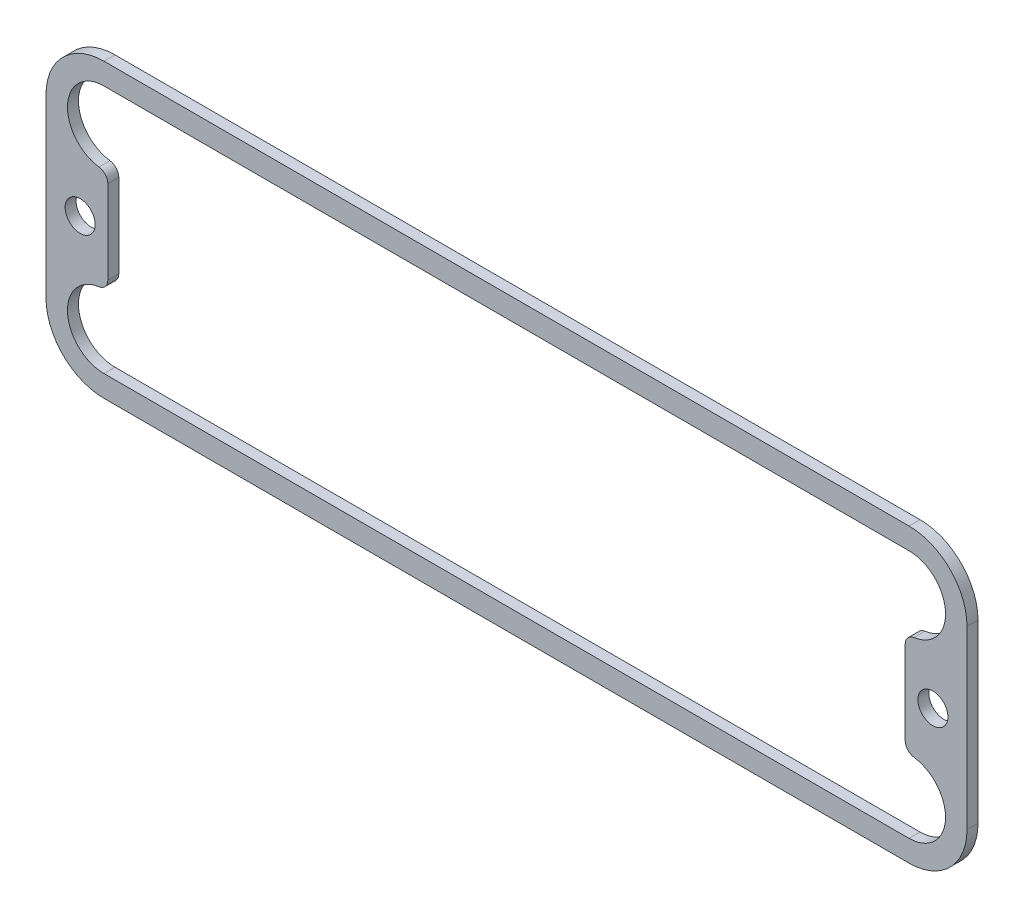
ISO-10303-21;
HEADER;
FILE_DESCRIPTION(('STEP AP214'),'2;1');
FILE_NAME('part.step','',(''),(''),'','','');
FILE_SCHEMA(('AUTOMOTIVE_DESIGN { 1 0 10303 214 1 1 1 1 }'));
ENDSEC;
DATA;
#1=APPLICATION_CONTEXT('core data for automotive mechanical design processes');
#2=APPLICATION_PROTOCOL_DEFINITION('international standard','automotive_design',2000,#1);
#3=PRODUCT_CONTEXT('',#1,'mechanical');
#4=PRODUCT('Part','Part','',(#3));
#5=PRODUCT_RELATED_PRODUCT_CATEGORY('part','',(#4));
#6=PRODUCT_DEFINITION_FORMATION('','',#4);
#7=PRODUCT_DEFINITION_CONTEXT('part definition',#1,'design');
#8=PRODUCT_DEFINITION('design','',#6,#7);
#9=PRODUCT_DEFINITION_SHAPE('','',#8);
#10=(LENGTH_UNIT() NAMED_UNIT(*) SI_UNIT(.MILLI.,.METRE.));
#11=(NAMED_UNIT(*) PLANE_ANGLE_UNIT() SI_UNIT($,.RADIAN.));
#12=(NAMED_UNIT(*) SI_UNIT($,.STERADIAN.) SOLID_ANGLE_UNIT());
#13=UNCERTAINTY_MEASURE_WITH_UNIT(LENGTH_MEASURE(1.E-05),#10,'distance_accuracy_value','');
#14=(GEOMETRIC_REPRESENTATION_CONTEXT(3) GLOBAL_UNCERTAINTY_ASSIGNED_CONTEXT((#13)) GLOBAL_UNIT_ASSIGNED_CONTEXT((#10,
#11,#12)) REPRESENTATION_CONTEXT('',''));
#15=CARTESIAN_POINT('',(0.,0.,0.));
#16=DIRECTION('',(0.,0.,1.));
#17=DIRECTION('',(1.,0.,0.));
#18=AXIS2_PLACEMENT_3D('',#15,#16,#17);
#19=CARTESIAN_POINT('',(23.8125,5.207,1.285));
#20=DIRECTION('',(0.,0.,1.));
#21=DIRECTION('',(1.,0.,0.));
#22=AXIS2_PLACEMENT_3D('',#19,#20,#21);
#23=PLANE('',#22);
#24=CARTESIAN_POINT('',(-25.223,0.,1.285));
#25=DIRECTION('',(0.,0.,1.));
#26=DIRECTION('',(1.,0.,0.));
#27=AXIS2_PLACEMENT_3D('',#24,#25,#26);
#28=CIRCLE('',#27,0.889);
#29=CARTESIAN_POINT('',(-24.334,0.,1.285));
#30=VERTEX_POINT('',#29);
#31=EDGE_CURVE('E268',#30,#30,#28,.T.);
#32=ORIENTED_EDGE('',*,*,#31,.F.);
#33=EDGE_LOOP('',(#32));
#34=FACE_BOUND('',#33,.T.);
#35=CARTESIAN_POINT('',(23.8125,5.207,1.285));
#36=DIRECTION('',(0.,0.,1.));
#37=DIRECTION('',(1.,0.,0.));
#38=AXIS2_PLACEMENT_3D('',#35,#36,#37);
#39=CIRCLE('',#38,3.429);
#40=CARTESIAN_POINT('',(27.2415,5.207,1.285));
#41=VERTEX_POINT('',#40);
#42=CARTESIAN_POINT('',(23.8125,8.636,1.285));
#43=VERTEX_POINT('',#42);
#44=EDGE_CURVE('E274',#41,#43,#39,.T.);
#45=ORIENTED_EDGE('',*,*,#44,.T.);
#46=DIRECTION('',(-1.,0.,0.));
#47=VECTOR('',#46,1.);
#48=CARTESIAN_POINT('',(23.8125,8.636,1.285));
#49=LINE('',#48,#47);
#50=CARTESIAN_POINT('',(-23.8125,8.636,1.285));
#51=VERTEX_POINT('',#50);
#52=EDGE_CURVE('E277',#43,#51,#49,.T.);
#53=ORIENTED_EDGE('',*,*,#52,.T.);
#54=CARTESIAN_POINT('',(-23.8125,5.207,1.285));
#55=DIRECTION('',(0.,0.,1.));
#56=DIRECTION('',(1.,0.,0.));
#57=AXIS2_PLACEMENT_3D('',#54,#55,#56);
#58=CIRCLE('',#57,3.429);
#59=CARTESIAN_POINT('',(-27.2415,5.207,1.285));
#60=VERTEX_POINT('',#59);
#61=EDGE_CURVE('E280',#51,#60,#58,.T.);
#62=ORIENTED_EDGE('',*,*,#61,.T.);
#63=DIRECTION('',(0.,-1.,0.));
#64=VECTOR('',#63,1.);
#65=CARTESIAN_POINT('',(-27.2415,5.207,1.285));
#66=LINE('',#65,#64);
#67=CARTESIAN_POINT('',(-27.2415,-5.207,1.285));
#68=VERTEX_POINT('',#67);
#69=EDGE_CURVE('E282',#60,#68,#66,.T.);
#70=ORIENTED_EDGE('',*,*,#69,.T.);
#71=CARTESIAN_POINT('',(-23.8125,-5.207,1.285));
#72=DIRECTION('',(0.,0.,1.));
#73=DIRECTION('',(1.,0.,0.));
#74=AXIS2_PLACEMENT_3D('',#71,#72,#73);
#75=CIRCLE('',#74,3.429);
#76=CARTESIAN_POINT('',(-23.8125,-8.636,1.285));
#77=VERTEX_POINT('',#76);
#78=EDGE_CURVE('E284',#68,#77,#75,.T.);
#79=ORIENTED_EDGE('',*,*,#78,.T.);
#80=DIRECTION('',(1.,0.,0.));
#81=VECTOR('',#80,1.);
#82=CARTESIAN_POINT('',(-23.8125,-8.636,1.285));
#83=LINE('',#82,#81);
#84=CARTESIAN_POINT('',(23.8125,-8.636,1.285));
#85=VERTEX_POINT('',#84);
#86=EDGE_CURVE('E286',#77,#85,#83,.T.);
#87=ORIENTED_EDGE('',*,*,#86,.T.);
#88=CARTESIAN_POINT('',(23.8125,-5.207,1.285));
#89=DIRECTION('',(0.,0.,1.));
#90=DIRECTION('',(1.,0.,0.));
#91=AXIS2_PLACEMENT_3D('',#88,#89,#90);
#92=CIRCLE('',#91,3.429);
#93=CARTESIAN_POINT('',(27.2415,-5.207,1.285));
#94=VERTEX_POINT('',#93);
#95=EDGE_CURVE('E288',#85,#94,#92,.T.);
#96=ORIENTED_EDGE('',*,*,#95,.T.);
#97=DIRECTION('',(0.,1.,0.));
#98=VECTOR('',#97,1.);
#99=CARTESIAN_POINT('',(27.2415,-5.207,1.285));
#100=LINE('',#99,#98);
#101=EDGE_CURVE('E290',#94,#41,#100,.T.);
#102=ORIENTED_EDGE('',*,*,#101,.T.);
#103=EDGE_LOOP('',(#45,#53,#62,#70,#79,#87,#96,#102));
#104=FACE_BOUND('',#103,.T.);
#105=CARTESIAN_POINT('',(25.223,0.,1.285));
#106=DIRECTION('',(0.,0.,1.));
#107=DIRECTION('',(1.,0.,0.));
#108=AXIS2_PLACEMENT_3D('',#105,#106,#107);
#109=CIRCLE('',#108,0.889);
#110=CARTESIAN_POINT('',(26.112,0.,1.285));
#111=VERTEX_POINT('',#110);
#112=EDGE_CURVE('E262',#111,#111,#109,.T.);
#113=ORIENTED_EDGE('',*,*,#112,.F.);
#114=EDGE_LOOP('',(#113));
#115=FACE_BOUND('',#114,.T.);
#116=CARTESIAN_POINT('',(24.18875,-2.47049474694457,1.285));
#117=DIRECTION('',(0.,0.,-1.));
#118=DIRECTION('',(1.,0.,0.));
#119=AXIS2_PLACEMENT_3D('',#116,#117,#118);
#120=CIRCLE('',#119,0.603249999999996);
#121=CARTESIAN_POINT('',(24.1065804597701,-3.06812233094517,1.285));
#122=VERTEX_POINT('',#121);
#123=CARTESIAN_POINT('',(23.5855,-2.47049474694456,1.285));
#124=VERTEX_POINT('',#123);
#125=EDGE_CURVE('E177',#122,#124,#120,.T.);
#126=ORIENTED_EDGE('',*,*,#125,.F.);
#127=CARTESIAN_POINT('',(23.8125,-5.207,1.285));
#128=DIRECTION('',(0.,0.,1.));
#129=DIRECTION('',(1.,0.,0.));
#130=AXIS2_PLACEMENT_3D('',#127,#128,#129);
#131=CIRCLE('',#130,2.159);
#132=CARTESIAN_POINT('',(23.8125,-7.366,1.285));
#133=VERTEX_POINT('',#132);
#134=EDGE_CURVE('E169',#133,#122,#131,.T.);
#135=ORIENTED_EDGE('',*,*,#134,.F.);
#136=DIRECTION('',(1.,0.,0.));
#137=VECTOR('',#136,1.);
#138=CARTESIAN_POINT('',(-23.8125,-7.36600000000001,1.285));
#139=LINE('',#138,#137);
#140=CARTESIAN_POINT('',(-23.8125,-7.366,1.285));
#141=VERTEX_POINT('',#140);
#142=EDGE_CURVE('E210',#141,#133,#139,.T.);
#143=ORIENTED_EDGE('',*,*,#142,.F.);
#144=CARTESIAN_POINT('',(-23.8125,-5.207,1.285));
#145=DIRECTION('',(0.,0.,1.));
#146=DIRECTION('',(1.,0.,0.));
#147=AXIS2_PLACEMENT_3D('',#144,#145,#146);
#148=CIRCLE('',#147,2.159);
#149=CARTESIAN_POINT('',(-24.1065804597701,-3.06812233094517,1.285));
#150=VERTEX_POINT('',#149);
#151=EDGE_CURVE('E208',#150,#141,#148,.T.);
#152=ORIENTED_EDGE('',*,*,#151,.F.);
#153=CARTESIAN_POINT('',(-24.18875,-2.47049474694457,1.285));
#154=DIRECTION('',(0.,0.,-1.));
#155=DIRECTION('',(1.,0.,0.));
#156=AXIS2_PLACEMENT_3D('',#153,#154,#155);
#157=CIRCLE('',#156,0.603249999999998);
#158=CARTESIAN_POINT('',(-23.5855,-2.47049474694457,1.285));
#159=VERTEX_POINT('',#158);
#160=EDGE_CURVE('E206',#159,#150,#157,.T.);
#161=ORIENTED_EDGE('',*,*,#160,.F.);
#162=DIRECTION('',(0.,-1.,0.));
#163=VECTOR('',#162,1.);
#164=CARTESIAN_POINT('',(-23.5855,2.47049474694456,1.285));
#165=LINE('',#164,#163);
#166=CARTESIAN_POINT('',(-23.5855,2.47049474694456,1.285));
#167=VERTEX_POINT('',#166);
#168=EDGE_CURVE('E204',#167,#159,#165,.T.);
#169=ORIENTED_EDGE('',*,*,#168,.F.);
#170=CARTESIAN_POINT('',(-24.18875,2.47049474694457,1.285));
#171=DIRECTION('',(0.,0.,-1.));
#172=DIRECTION('',(1.,0.,0.));
#173=AXIS2_PLACEMENT_3D('',#170,#171,#172);
#174=CIRCLE('',#173,0.603249999999998);
#175=CARTESIAN_POINT('',(-24.1065804597701,3.06812233094518,1.285));
#176=VERTEX_POINT('',#175);
#177=EDGE_CURVE('E202',#176,#167,#174,.T.);
#178=ORIENTED_EDGE('',*,*,#177,.F.);
#179=CARTESIAN_POINT('',(-23.8125,5.207,1.285));
#180=DIRECTION('',(0.,0.,1.));
#181=DIRECTION('',(1.,0.,0.));
#182=AXIS2_PLACEMENT_3D('',#179,#180,#181);
#183=CIRCLE('',#182,2.159);
#184=CARTESIAN_POINT('',(-23.8125,7.366,1.285));
#185=VERTEX_POINT('',#184);
#186=EDGE_CURVE('E200',#185,#176,#183,.T.);
#187=ORIENTED_EDGE('',*,*,#186,.F.);
#188=DIRECTION('',(-1.,0.,0.));
#189=VECTOR('',#188,1.);
#190=CARTESIAN_POINT('',(23.8125,7.366,1.285));
#191=LINE('',#190,#189);
#192=CARTESIAN_POINT('',(23.8125,7.366,1.285));
#193=VERTEX_POINT('',#192);
#194=EDGE_CURVE('E198',#193,#185,#191,.T.);
#195=ORIENTED_EDGE('',*,*,#194,.F.);
#196=CARTESIAN_POINT('',(23.8125,5.207,1.285));
#197=DIRECTION('',(0.,0.,1.));
#198=DIRECTION('',(1.,0.,0.));
#199=AXIS2_PLACEMENT_3D('',#196,#197,#198);
#200=CIRCLE('',#199,2.159);
#201=CARTESIAN_POINT('',(24.1065804597701,3.06812233094518,1.285));
#202=VERTEX_POINT('',#201);
#203=EDGE_CURVE('E196',#202,#193,#200,.T.);
#204=ORIENTED_EDGE('',*,*,#203,.F.);
#205=CARTESIAN_POINT('',(24.18875,2.47049474694457,1.285));
#206=DIRECTION('',(0.,0.,-1.));
#207=DIRECTION('',(1.,0.,0.));
#208=AXIS2_PLACEMENT_3D('',#205,#206,#207);
#209=CIRCLE('',#208,0.60325);
#210=CARTESIAN_POINT('',(23.5855,2.47049474694456,1.285));
#211=VERTEX_POINT('',#210);
#212=EDGE_CURVE('E192',#211,#202,#209,.T.);
#213=ORIENTED_EDGE('',*,*,#212,.F.);
#214=DIRECTION('',(0.,1.,0.));
#215=VECTOR('',#214,1.);
#216=CARTESIAN_POINT('',(23.5855,-2.47049474694456,1.285));
#217=LINE('',#216,#215);
#218=EDGE_CURVE('E190',#124,#211,#217,.T.);
#219=ORIENTED_EDGE('',*,*,#218,.F.);
#220=EDGE_LOOP('',(#126,#135,#143,#152,#161,#169,#178,#187,#195,#204,#213,#219));
#221=FACE_BOUND('',#220,.T.);
#222=ADVANCED_FACE('F32',(#34,#104,#115,#221),#23,.T.);
#223=CARTESIAN_POINT('',(23.8125,5.207,0.634999999999997));
#224=DIRECTION('',(0.,0.,1.));
#225=DIRECTION('',(1.,0.,0.));
#226=AXIS2_PLACEMENT_3D('',#223,#224,#225);
#227=PLANE('',#226);
#228=CARTESIAN_POINT('',(25.223,0.,0.634999999999997));
#229=DIRECTION('',(0.,0.,1.));
#230=DIRECTION('',(1.,0.,0.));
#231=AXIS2_PLACEMENT_3D('',#228,#229,#230);
#232=CIRCLE('',#231,0.889);
#233=CARTESIAN_POINT('',(26.112,0.,0.634999999999997));
#234=VERTEX_POINT('',#233);
#235=EDGE_CURVE('E185',#234,#234,#232,.T.);
#236=ORIENTED_EDGE('',*,*,#235,.T.);
#237=EDGE_LOOP('',(#236));
#238=FACE_BOUND('',#237,.T.);
#239=CARTESIAN_POINT('',(-25.223,0.,0.634999999999997));
#240=DIRECTION('',(0.,0.,1.));
#241=DIRECTION('',(1.,0.,0.));
#242=AXIS2_PLACEMENT_3D('',#239,#240,#241);
#243=CIRCLE('',#242,0.889);
#244=CARTESIAN_POINT('',(-24.334,0.,0.634999999999997));
#245=VERTEX_POINT('',#244);
#246=EDGE_CURVE('E265',#245,#245,#243,.T.);
#247=ORIENTED_EDGE('',*,*,#246,.T.);
#248=EDGE_LOOP('',(#247));
#249=FACE_BOUND('',#248,.T.);
#250=CARTESIAN_POINT('',(23.8125,5.207,0.634999999999997));
#251=DIRECTION('',(0.,0.,1.));
#252=DIRECTION('',(1.,0.,0.));
#253=AXIS2_PLACEMENT_3D('',#250,#251,#252);
#254=CIRCLE('',#253,3.429);
#255=CARTESIAN_POINT('',(27.2415,5.207,0.634999999999997));
#256=VERTEX_POINT('',#255);
#257=CARTESIAN_POINT('',(23.8125,8.636,0.634999999999997));
#258=VERTEX_POINT('',#257);
#259=EDGE_CURVE('E271',#256,#258,#254,.T.);
#260=ORIENTED_EDGE('',*,*,#259,.F.);
#261=DIRECTION('',(0.,1.,0.));
#262=VECTOR('',#261,1.);
#263=CARTESIAN_POINT('',(27.2415,-5.207,0.634999999999997));
#264=LINE('',#263,#262);
#265=CARTESIAN_POINT('',(27.2415,-5.207,0.634999999999997));
#266=VERTEX_POINT('',#265);
#267=EDGE_CURVE('E278',#266,#256,#264,.T.);
#268=ORIENTED_EDGE('',*,*,#267,.F.);
#269=CARTESIAN_POINT('',(23.8125,-5.207,0.634999999999997));
#270=DIRECTION('',(0.,0.,1.));
#271=DIRECTION('',(1.,0.,0.));
#272=AXIS2_PLACEMENT_3D('',#269,#270,#271);
#273=CIRCLE('',#272,3.429);
#274=CARTESIAN_POINT('',(23.8125,-8.636,0.634999999999997));
#275=VERTEX_POINT('',#274);
#276=EDGE_CURVE('E305',#275,#266,#273,.T.);
#277=ORIENTED_EDGE('',*,*,#276,.F.);
#278=DIRECTION('',(1.,0.,0.));
#279=VECTOR('',#278,1.);
#280=CARTESIAN_POINT('',(-23.8125,-8.636,0.634999999999997));
#281=LINE('',#280,#279);
#282=CARTESIAN_POINT('',(-23.8125,-8.636,0.634999999999997));
#283=VERTEX_POINT('',#282);
#284=EDGE_CURVE('E303',#283,#275,#281,.T.);
#285=ORIENTED_EDGE('',*,*,#284,.F.);
#286=CARTESIAN_POINT('',(-23.8125,-5.207,0.634999999999997));
#287=DIRECTION('',(0.,0.,1.));
#288=DIRECTION('',(1.,0.,0.));
#289=AXIS2_PLACEMENT_3D('',#286,#287,#288);
#290=CIRCLE('',#289,3.429);
#291=CARTESIAN_POINT('',(-27.2415,-5.207,0.634999999999997));
#292=VERTEX_POINT('',#291);
#293=EDGE_CURVE('E301',#292,#283,#290,.T.);
#294=ORIENTED_EDGE('',*,*,#293,.F.);
#295=DIRECTION('',(0.,-1.,0.));
#296=VECTOR('',#295,1.);
#297=CARTESIAN_POINT('',(-27.2415,5.207,0.634999999999997));
#298=LINE('',#297,#296);
#299=CARTESIAN_POINT('',(-27.2415,5.207,0.634999999999997));
#300=VERTEX_POINT('',#299);
#301=EDGE_CURVE('E299',#300,#292,#298,.T.);
#302=ORIENTED_EDGE('',*,*,#301,.F.);
#303=CARTESIAN_POINT('',(-23.8125,5.207,0.634999999999997));
#304=DIRECTION('',(0.,0.,1.));
#305=DIRECTION('',(1.,0.,0.));
#306=AXIS2_PLACEMENT_3D('',#303,#304,#305);
#307=CIRCLE('',#306,3.429);
#308=CARTESIAN_POINT('',(-23.8125,8.636,0.634999999999997));
#309=VERTEX_POINT('',#308);
#310=EDGE_CURVE('E297',#309,#300,#307,.T.);
#311=ORIENTED_EDGE('',*,*,#310,.F.);
#312=DIRECTION('',(-1.,0.,0.));
#313=VECTOR('',#312,1.);
#314=CARTESIAN_POINT('',(23.8125,8.636,0.634999999999997));
#315=LINE('',#314,#313);
#316=EDGE_CURVE('E295',#258,#309,#315,.T.);
#317=ORIENTED_EDGE('',*,*,#316,.F.);
#318=EDGE_LOOP('',(#260,#268,#277,#285,#294,#302,#311,#317));
#319=FACE_BOUND('',#318,.T.);
#320=CARTESIAN_POINT('',(23.8125,-5.207,0.634999999999997));
#321=DIRECTION('',(0.,0.,1.));
#322=DIRECTION('',(1.,0.,0.));
#323=AXIS2_PLACEMENT_3D('',#320,#321,#322);
#324=CIRCLE('',#323,2.159);
#325=CARTESIAN_POINT('',(23.8125,-7.366,0.634999999999997));
#326=VERTEX_POINT('',#325);
#327=CARTESIAN_POINT('',(24.1065804597701,-3.06812233094517,0.634999999999997));
#328=VERTEX_POINT('',#327);
#329=EDGE_CURVE('E55',#326,#328,#324,.T.);
#330=ORIENTED_EDGE('',*,*,#329,.T.);
#331=CARTESIAN_POINT('',(24.18875,-2.47049474694457,0.634999999999997));
#332=DIRECTION('',(0.,0.,-1.));
#333=DIRECTION('',(1.,0.,0.));
#334=AXIS2_PLACEMENT_3D('',#331,#332,#333);
#335=CIRCLE('',#334,0.603249999999996);
#336=CARTESIAN_POINT('',(23.5855,-2.47049474694456,0.634999999999997));
#337=VERTEX_POINT('',#336);
#338=EDGE_CURVE('E184',#328,#337,#335,.T.);
#339=ORIENTED_EDGE('',*,*,#338,.T.);
#340=DIRECTION('',(0.,1.,0.));
#341=VECTOR('',#340,1.);
#342=CARTESIAN_POINT('',(23.5855,-2.47049474694456,0.634999999999997));
#343=LINE('',#342,#341);
#344=CARTESIAN_POINT('',(23.5855,2.47049474694456,0.634999999999997));
#345=VERTEX_POINT('',#344);
#346=EDGE_CURVE('E214',#337,#345,#343,.T.);
#347=ORIENTED_EDGE('',*,*,#346,.T.);
#348=CARTESIAN_POINT('',(24.18875,2.47049474694457,0.634999999999997));
#349=DIRECTION('',(0.,0.,-1.));
#350=DIRECTION('',(1.,0.,0.));
#351=AXIS2_PLACEMENT_3D('',#348,#349,#350);
#352=CIRCLE('',#351,0.60325);
#353=CARTESIAN_POINT('',(24.1065804597701,3.06812233094518,0.634999999999997));
#354=VERTEX_POINT('',#353);
#355=EDGE_CURVE('E217',#345,#354,#352,.T.);
#356=ORIENTED_EDGE('',*,*,#355,.T.);
#357=CARTESIAN_POINT('',(23.8125,5.207,0.634999999999997));
#358=DIRECTION('',(0.,0.,1.));
#359=DIRECTION('',(1.,0.,0.));
#360=AXIS2_PLACEMENT_3D('',#357,#358,#359);
#361=CIRCLE('',#360,2.159);
#362=CARTESIAN_POINT('',(23.8125,7.366,0.634999999999997));
#363=VERTEX_POINT('',#362);
#364=EDGE_CURVE('E220',#354,#363,#361,.T.);
#365=ORIENTED_EDGE('',*,*,#364,.T.);
#366=DIRECTION('',(-1.,0.,0.));
#367=VECTOR('',#366,1.);
#368=CARTESIAN_POINT('',(23.8125,7.366,0.634999999999997));
#369=LINE('',#368,#367);
#370=CARTESIAN_POINT('',(-23.8125,7.366,0.634999999999997));
#371=VERTEX_POINT('',#370);
#372=EDGE_CURVE('E223',#363,#371,#369,.T.);
#373=ORIENTED_EDGE('',*,*,#372,.T.);
#374=CARTESIAN_POINT('',(-23.8125,5.207,0.634999999999997));
#375=DIRECTION('',(0.,0.,1.));
#376=DIRECTION('',(1.,0.,0.));
#377=AXIS2_PLACEMENT_3D('',#374,#375,#376);
#378=CIRCLE('',#377,2.159);
#379=CARTESIAN_POINT('',(-24.1065804597701,3.06812233094518,0.634999999999997));
#380=VERTEX_POINT('',#379);
#381=EDGE_CURVE('E226',#371,#380,#378,.T.);
#382=ORIENTED_EDGE('',*,*,#381,.T.);
#383=CARTESIAN_POINT('',(-24.18875,2.47049474694457,0.634999999999997));
#384=DIRECTION('',(0.,0.,-1.));
#385=DIRECTION('',(1.,0.,0.));
#386=AXIS2_PLACEMENT_3D('',#383,#384,#385);
#387=CIRCLE('',#386,0.603249999999998);
#388=CARTESIAN_POINT('',(-23.5855,2.47049474694456,0.634999999999997));
#389=VERTEX_POINT('',#388);
#390=EDGE_CURVE('E229',#380,#389,#387,.T.);
#391=ORIENTED_EDGE('',*,*,#390,.T.);
#392=DIRECTION('',(0.,-1.,0.));
#393=VECTOR('',#392,1.);
#394=CARTESIAN_POINT('',(-23.5855,2.47049474694456,0.634999999999997));
#395=LINE('',#394,#393);
#396=CARTESIAN_POINT('',(-23.5855,-2.47049474694457,0.634999999999997));
#397=VERTEX_POINT('',#396);
#398=EDGE_CURVE('E232',#389,#397,#395,.T.);
#399=ORIENTED_EDGE('',*,*,#398,.T.);
#400=CARTESIAN_POINT('',(-24.18875,-2.47049474694457,0.634999999999997));
#401=DIRECTION('',(0.,0.,-1.));
#402=DIRECTION('',(1.,0.,0.));
#403=AXIS2_PLACEMENT_3D('',#400,#401,#402);
#404=CIRCLE('',#403,0.603249999999998);
#405=CARTESIAN_POINT('',(-24.1065804597701,-3.06812233094517,0.634999999999997));
#406=VERTEX_POINT('',#405);
#407=EDGE_CURVE('E235',#397,#406,#404,.T.);
#408=ORIENTED_EDGE('',*,*,#407,.T.);
#409=CARTESIAN_POINT('',(-23.8125,-5.207,0.634999999999997));
#410=DIRECTION('',(0.,0.,1.));
#411=DIRECTION('',(1.,0.,0.));
#412=AXIS2_PLACEMENT_3D('',#409,#410,#411);
#413=CIRCLE('',#412,2.159);
#414=CARTESIAN_POINT('',(-23.8125,-7.36600000000001,0.634999999999997));
#415=VERTEX_POINT('',#414);
#416=EDGE_CURVE('E238',#406,#415,#413,.T.);
#417=ORIENTED_EDGE('',*,*,#416,.T.);
#418=DIRECTION('',(1.,0.,0.));
#419=VECTOR('',#418,1.);
#420=CARTESIAN_POINT('',(-23.8125,-7.36600000000001,0.634999999999997));
#421=LINE('',#420,#419);
#422=EDGE_CURVE('E178',#415,#326,#421,.T.);
#423=ORIENTED_EDGE('',*,*,#422,.T.);
#424=EDGE_LOOP('',(#330,#339,#347,#356,#365,#373,#382,#391,#399,#408,#417,#423));
#425=FACE_BOUND('',#424,.T.);
#426=ADVANCED_FACE('F335',(#238,#249,#319,#425),#227,.F.);
#427=CARTESIAN_POINT('',(23.8125,5.207,1.285));
#428=DIRECTION('',(0.,0.,-1.));
#429=DIRECTION('',(-1.,0.,0.));
#430=AXIS2_PLACEMENT_3D('',#427,#428,#429);
#431=CYLINDRICAL_SURFACE('',#430,3.429);
#432=ORIENTED_EDGE('',*,*,#259,.T.);
#433=DIRECTION('',(0.,0.,-1.));
#434=VECTOR('',#433,1.);
#435=CARTESIAN_POINT('',(23.8125,8.636,1.285));
#436=LINE('',#435,#434);
#437=EDGE_CURVE('E11',#43,#258,#436,.T.);
#438=ORIENTED_EDGE('',*,*,#437,.F.);
#439=ORIENTED_EDGE('',*,*,#44,.F.);
#440=DIRECTION('',(0.,0.,-1.));
#441=VECTOR('',#440,1.);
#442=CARTESIAN_POINT('',(27.2415,5.207,1.285));
#443=LINE('',#442,#441);
#444=EDGE_CURVE('E292',#41,#256,#443,.T.);
#445=ORIENTED_EDGE('',*,*,#444,.T.);
#446=EDGE_LOOP('',(#432,#438,#439,#445));
#447=FACE_BOUND('',#446,.T.);
#448=ADVANCED_FACE('F34',(#447),#431,.T.);
#449=CARTESIAN_POINT('',(23.8125,8.636,1.285));
#450=DIRECTION('',(0.,-1.,0.));
#451=DIRECTION('',(0.,0.,-1.));
#452=AXIS2_PLACEMENT_3D('',#449,#450,#451);
#453=PLANE('',#452);
#454=ORIENTED_EDGE('',*,*,#316,.T.);
#455=DIRECTION('',(0.,0.,-1.));
#456=VECTOR('',#455,1.);
#457=CARTESIAN_POINT('',(-23.8125,8.636,1.285));
#458=LINE('',#457,#456);
#459=EDGE_CURVE('E40',#51,#309,#458,.T.);
#460=ORIENTED_EDGE('',*,*,#459,.F.);
#461=ORIENTED_EDGE('',*,*,#52,.F.);
#462=ORIENTED_EDGE('',*,*,#437,.T.);
#463=EDGE_LOOP('',(#454,#460,#461,#462));
#464=FACE_BOUND('',#463,.T.);
#465=ADVANCED_FACE('F353',(#464),#453,.F.);
#466=CARTESIAN_POINT('',(-23.8125,5.207,1.285));
#467=DIRECTION('',(0.,0.,-1.));
#468=DIRECTION('',(-1.,0.,0.));
#469=AXIS2_PLACEMENT_3D('',#466,#467,#468);
#470=CYLINDRICAL_SURFACE('',#469,3.429);
#471=ORIENTED_EDGE('',*,*,#310,.T.);
#472=DIRECTION('',(0.,0.,-1.));
#473=VECTOR('',#472,1.);
#474=CARTESIAN_POINT('',(-27.2415,5.207,1.285));
#475=LINE('',#474,#473);
#476=EDGE_CURVE('E322',#60,#300,#475,.T.);
#477=ORIENTED_EDGE('',*,*,#476,.F.);
#478=ORIENTED_EDGE('',*,*,#61,.F.);
#479=ORIENTED_EDGE('',*,*,#459,.T.);
#480=EDGE_LOOP('',(#471,#477,#478,#479));
#481=FACE_BOUND('',#480,.T.);
#482=ADVANCED_FACE('F329',(#481),#470,.T.);
#483=CARTESIAN_POINT('',(-27.2415,5.207,1.285));
#484=DIRECTION('',(1.,0.,0.));
#485=DIRECTION('',(0.,0.,-1.));
#486=AXIS2_PLACEMENT_3D('',#483,#484,#485);
#487=PLANE('',#486);
#488=ORIENTED_EDGE('',*,*,#301,.T.);
#489=DIRECTION('',(0.,0.,-1.));
#490=VECTOR('',#489,1.);
#491=CARTESIAN_POINT('',(-27.2415,-5.207,1.285));
#492=LINE('',#491,#490);
#493=EDGE_CURVE('E319',#68,#292,#492,.T.);
#494=ORIENTED_EDGE('',*,*,#493,.F.);
#495=ORIENTED_EDGE('',*,*,#69,.F.);
#496=ORIENTED_EDGE('',*,*,#476,.T.);
#497=EDGE_LOOP('',(#488,#494,#495,#496));
#498=FACE_BOUND('',#497,.T.);
#499=ADVANCED_FACE('F341',(#498),#487,.F.);
#500=CARTESIAN_POINT('',(-23.8125,-5.207,1.285));
#501=DIRECTION('',(0.,0.,-1.));
#502=DIRECTION('',(-1.,0.,0.));
#503=AXIS2_PLACEMENT_3D('',#500,#501,#502);
#504=CYLINDRICAL_SURFACE('',#503,3.429);
#505=ORIENTED_EDGE('',*,*,#293,.T.);
#506=DIRECTION('',(0.,0.,-1.));
#507=VECTOR('',#506,1.);
#508=CARTESIAN_POINT('',(-23.8125,-8.636,1.285));
#509=LINE('',#508,#507);
#510=EDGE_CURVE('E316',#77,#283,#509,.T.);
#511=ORIENTED_EDGE('',*,*,#510,.F.);
#512=ORIENTED_EDGE('',*,*,#78,.F.);
#513=ORIENTED_EDGE('',*,*,#493,.T.);
#514=EDGE_LOOP('',(#505,#511,#512,#513));
#515=FACE_BOUND('',#514,.T.);
#516=ADVANCED_FACE('F345',(#515),#504,.T.);
#517=CARTESIAN_POINT('',(-23.8125,-8.636,1.285));
#518=DIRECTION('',(0.,1.,0.));
#519=DIRECTION('',(-1.,0.,0.));
#520=AXIS2_PLACEMENT_3D('',#517,#518,#519);
#521=PLANE('',#520);
#522=ORIENTED_EDGE('',*,*,#284,.T.);
#523=DIRECTION('',(0.,0.,-1.));
#524=VECTOR('',#523,1.);
#525=CARTESIAN_POINT('',(23.8125,-8.636,1.285));
#526=LINE('',#525,#524);
#527=EDGE_CURVE('E313',#85,#275,#526,.T.);
#528=ORIENTED_EDGE('',*,*,#527,.F.);
#529=ORIENTED_EDGE('',*,*,#86,.F.);
#530=ORIENTED_EDGE('',*,*,#510,.T.);
#531=EDGE_LOOP('',(#522,#528,#529,#530));
#532=FACE_BOUND('',#531,.T.);
#533=ADVANCED_FACE('F366',(#532),#521,.F.);
#534=CARTESIAN_POINT('',(23.8125,-5.207,1.285));
#535=DIRECTION('',(0.,0.,-1.));
#536=DIRECTION('',(-1.,0.,0.));
#537=AXIS2_PLACEMENT_3D('',#534,#535,#536);
#538=CYLINDRICAL_SURFACE('',#537,3.429);
#539=ORIENTED_EDGE('',*,*,#276,.T.);
#540=DIRECTION('',(0.,0.,-1.));
#541=VECTOR('',#540,1.);
#542=CARTESIAN_POINT('',(27.2415,-5.207,1.285));
#543=LINE('',#542,#541);
#544=EDGE_CURVE('E310',#94,#266,#543,.T.);
#545=ORIENTED_EDGE('',*,*,#544,.F.);
#546=ORIENTED_EDGE('',*,*,#95,.F.);
#547=ORIENTED_EDGE('',*,*,#527,.T.);
#548=EDGE_LOOP('',(#539,#545,#546,#547));
#549=FACE_BOUND('',#548,.T.);
#550=ADVANCED_FACE('F364',(#549),#538,.T.);
#551=CARTESIAN_POINT('',(27.2415,-5.207,1.285));
#552=DIRECTION('',(-1.,0.,0.));
#553=DIRECTION('',(0.,0.,1.));
#554=AXIS2_PLACEMENT_3D('',#551,#552,#553);
#555=PLANE('',#554);
#556=ORIENTED_EDGE('',*,*,#267,.T.);
#557=ORIENTED_EDGE('',*,*,#444,.F.);
#558=ORIENTED_EDGE('',*,*,#101,.F.);
#559=ORIENTED_EDGE('',*,*,#544,.T.);
#560=EDGE_LOOP('',(#556,#557,#558,#559));
#561=FACE_BOUND('',#560,.T.);
#562=ADVANCED_FACE('F359',(#561),#555,.F.);
#563=CARTESIAN_POINT('',(-25.223,0.,1.285));
#564=DIRECTION('',(0.,0.,-1.));
#565=DIRECTION('',(-1.,0.,0.));
#566=AXIS2_PLACEMENT_3D('',#563,#564,#565);
#567=CYLINDRICAL_SURFACE('',#566,0.889);
#568=ORIENTED_EDGE('',*,*,#31,.T.);
#569=EDGE_LOOP('',(#568));
#570=FACE_BOUND('',#569,.T.);
#571=ORIENTED_EDGE('',*,*,#246,.F.);
#572=EDGE_LOOP('',(#571));
#573=FACE_BOUND('',#572,.T.);
#574=ADVANCED_FACE('F385',(#570,#573),#567,.F.);
#575=CARTESIAN_POINT('',(25.223,0.,1.285));
#576=DIRECTION('',(0.,0.,-1.));
#577=DIRECTION('',(-1.,0.,0.));
#578=AXIS2_PLACEMENT_3D('',#575,#576,#577);
#579=CYLINDRICAL_SURFACE('',#578,0.889);
#580=ORIENTED_EDGE('',*,*,#112,.T.);
#581=EDGE_LOOP('',(#580));
#582=FACE_BOUND('',#581,.T.);
#583=ORIENTED_EDGE('',*,*,#235,.F.);
#584=EDGE_LOOP('',(#583));
#585=FACE_BOUND('',#584,.T.);
#586=ADVANCED_FACE('F392',(#582,#585),#579,.F.);
#587=CARTESIAN_POINT('',(23.8125,-5.207,1.285));
#588=DIRECTION('',(0.,0.,-1.));
#589=DIRECTION('',(-1.,0.,0.));
#590=AXIS2_PLACEMENT_3D('',#587,#588,#589);
#591=CYLINDRICAL_SURFACE('',#590,2.159);
#592=ORIENTED_EDGE('',*,*,#329,.F.);
#593=DIRECTION('',(0.,0.,-1.));
#594=VECTOR('',#593,1.);
#595=CARTESIAN_POINT('',(23.8125,-7.366,1.285));
#596=LINE('',#595,#594);
#597=EDGE_CURVE('E173',#133,#326,#596,.T.);
#598=ORIENTED_EDGE('',*,*,#597,.F.);
#599=ORIENTED_EDGE('',*,*,#134,.T.);
#600=DIRECTION('',(0.,0.,-1.));
#601=VECTOR('',#600,1.);
#602=CARTESIAN_POINT('',(24.1065804597701,-3.06812233094517,1.285));
#603=LINE('',#602,#601);
#604=EDGE_CURVE('E172',#122,#328,#603,.T.);
#605=ORIENTED_EDGE('',*,*,#604,.T.);
#606=EDGE_LOOP('',(#592,#598,#599,#605));
#607=FACE_BOUND('',#606,.T.);
#608=ADVANCED_FACE('F171',(#607),#591,.F.);
#609=CARTESIAN_POINT('',(24.18875,-2.47049474694457,1.285));
#610=DIRECTION('',(0.,0.,-1.));
#611=DIRECTION('',(-1.,0.,0.));
#612=AXIS2_PLACEMENT_3D('',#609,#610,#611);
#613=CYLINDRICAL_SURFACE('',#612,0.603249999999996);
#614=ORIENTED_EDGE('',*,*,#338,.F.);
#615=ORIENTED_EDGE('',*,*,#604,.F.);
#616=ORIENTED_EDGE('',*,*,#125,.T.);
#617=DIRECTION('',(0.,0.,-1.));
#618=VECTOR('',#617,1.);
#619=CARTESIAN_POINT('',(23.5855,-2.47049474694456,1.285));
#620=LINE('',#619,#618);
#621=EDGE_CURVE('E186',#124,#337,#620,.T.);
#622=ORIENTED_EDGE('',*,*,#621,.T.);
#623=EDGE_LOOP('',(#614,#615,#616,#622));
#624=FACE_BOUND('',#623,.T.);
#625=ADVANCED_FACE('F181',(#624),#613,.T.);
#626=CARTESIAN_POINT('',(23.5855,-2.47049474694456,1.285));
#627=DIRECTION('',(-1.,0.,0.));
#628=DIRECTION('',(0.,-1.,0.));
#629=AXIS2_PLACEMENT_3D('',#626,#627,#628);
#630=PLANE('',#629);
#631=ORIENTED_EDGE('',*,*,#346,.F.);
#632=ORIENTED_EDGE('',*,*,#621,.F.);
#633=ORIENTED_EDGE('',*,*,#218,.T.);
#634=DIRECTION('',(0.,0.,-1.));
#635=VECTOR('',#634,1.);
#636=CARTESIAN_POINT('',(23.5855,2.47049474694456,1.285));
#637=LINE('',#636,#635);
#638=EDGE_CURVE('E259',#211,#345,#637,.T.);
#639=ORIENTED_EDGE('',*,*,#638,.T.);
#640=EDGE_LOOP('',(#631,#632,#633,#639));
#641=FACE_BOUND('',#640,.T.);
#642=ADVANCED_FACE('F409',(#641),#630,.T.);
#643=CARTESIAN_POINT('',(24.18875,2.47049474694457,1.285));
#644=DIRECTION('',(0.,0.,-1.));
#645=DIRECTION('',(-1.,0.,0.));
#646=AXIS2_PLACEMENT_3D('',#643,#644,#645);
#647=CYLINDRICAL_SURFACE('',#646,0.60325);
#648=ORIENTED_EDGE('',*,*,#355,.F.);
#649=ORIENTED_EDGE('',*,*,#638,.F.);
#650=ORIENTED_EDGE('',*,*,#212,.T.);
#651=DIRECTION('',(0.,0.,-1.));
#652=VECTOR('',#651,1.);
#653=CARTESIAN_POINT('',(24.1065804597701,3.06812233094518,1.285));
#654=LINE('',#653,#652);
#655=EDGE_CURVE('E257',#202,#354,#654,.T.);
#656=ORIENTED_EDGE('',*,*,#655,.T.);
#657=EDGE_LOOP('',(#648,#649,#650,#656));
#658=FACE_BOUND('',#657,.T.);
#659=ADVANCED_FACE('F412',(#658),#647,.T.);
#660=CARTESIAN_POINT('',(23.8125,5.207,1.285));
#661=DIRECTION('',(0.,0.,-1.));
#662=DIRECTION('',(-1.,0.,0.));
#663=AXIS2_PLACEMENT_3D('',#660,#661,#662);
#664=CYLINDRICAL_SURFACE('',#663,2.159);
#665=ORIENTED_EDGE('',*,*,#364,.F.);
#666=ORIENTED_EDGE('',*,*,#655,.F.);
#667=ORIENTED_EDGE('',*,*,#203,.T.);
#668=DIRECTION('',(0.,0.,-1.));
#669=VECTOR('',#668,1.);
#670=CARTESIAN_POINT('',(23.8125,7.366,1.285));
#671=LINE('',#670,#669);
#672=EDGE_CURVE('E255',#193,#363,#671,.T.);
#673=ORIENTED_EDGE('',*,*,#672,.T.);
#674=EDGE_LOOP('',(#665,#666,#667,#673));
#675=FACE_BOUND('',#674,.T.);
#676=ADVANCED_FACE('F416',(#675),#664,.F.);
#677=CARTESIAN_POINT('',(23.8125,7.366,1.285));
#678=DIRECTION('',(0.,-1.,0.));
#679=DIRECTION('',(0.,0.,-1.));
#680=AXIS2_PLACEMENT_3D('',#677,#678,#679);
#681=PLANE('',#680);
#682=ORIENTED_EDGE('',*,*,#372,.F.);
#683=ORIENTED_EDGE('',*,*,#672,.F.);
#684=ORIENTED_EDGE('',*,*,#194,.T.);
#685=DIRECTION('',(0.,0.,-1.));
#686=VECTOR('',#685,1.);
#687=CARTESIAN_POINT('',(-23.8125,7.366,1.285));
#688=LINE('',#687,#686);
#689=EDGE_CURVE('E253',#185,#371,#688,.T.);
#690=ORIENTED_EDGE('',*,*,#689,.T.);
#691=EDGE_LOOP('',(#682,#683,#684,#690));
#692=FACE_BOUND('',#691,.T.);
#693=ADVANCED_FACE('F420',(#692),#681,.T.);
#694=CARTESIAN_POINT('',(-23.8125,5.207,1.285));
#695=DIRECTION('',(0.,0.,-1.));
#696=DIRECTION('',(-1.,0.,0.));
#697=AXIS2_PLACEMENT_3D('',#694,#695,#696);
#698=CYLINDRICAL_SURFACE('',#697,2.159);
#699=ORIENTED_EDGE('',*,*,#381,.F.);
#700=ORIENTED_EDGE('',*,*,#689,.F.);
#701=ORIENTED_EDGE('',*,*,#186,.T.);
#702=DIRECTION('',(0.,0.,-1.));
#703=VECTOR('',#702,1.);
#704=CARTESIAN_POINT('',(-24.1065804597701,3.06812233094518,1.285));
#705=LINE('',#704,#703);
#706=EDGE_CURVE('E251',#176,#380,#705,.T.);
#707=ORIENTED_EDGE('',*,*,#706,.T.);
#708=EDGE_LOOP('',(#699,#700,#701,#707));
#709=FACE_BOUND('',#708,.T.);
#710=ADVANCED_FACE('F424',(#709),#698,.F.);
#711=CARTESIAN_POINT('',(-24.18875,2.47049474694457,1.285));
#712=DIRECTION('',(0.,0.,-1.));
#713=DIRECTION('',(-1.,0.,0.));
#714=AXIS2_PLACEMENT_3D('',#711,#712,#713);
#715=CYLINDRICAL_SURFACE('',#714,0.603249999999998);
#716=ORIENTED_EDGE('',*,*,#390,.F.);
#717=ORIENTED_EDGE('',*,*,#706,.F.);
#718=ORIENTED_EDGE('',*,*,#177,.T.);
#719=DIRECTION('',(0.,0.,-1.));
#720=VECTOR('',#719,1.);
#721=CARTESIAN_POINT('',(-23.5855,2.47049474694456,1.285));
#722=LINE('',#721,#720);
#723=EDGE_CURVE('E249',#167,#389,#722,.T.);
#724=ORIENTED_EDGE('',*,*,#723,.T.);
#725=EDGE_LOOP('',(#716,#717,#718,#724));
#726=FACE_BOUND('',#725,.T.);
#727=ADVANCED_FACE('F428',(#726),#715,.T.);
#728=CARTESIAN_POINT('',(-23.5855,2.47049474694456,1.285));
#729=DIRECTION('',(1.,0.,0.));
#730=DIRECTION('',(0.,0.,-1.));
#731=AXIS2_PLACEMENT_3D('',#728,#729,#730);
#732=PLANE('',#731);
#733=ORIENTED_EDGE('',*,*,#398,.F.);
#734=ORIENTED_EDGE('',*,*,#723,.F.);
#735=ORIENTED_EDGE('',*,*,#168,.T.);
#736=DIRECTION('',(0.,0.,-1.));
#737=VECTOR('',#736,1.);
#738=CARTESIAN_POINT('',(-23.5855,-2.47049474694457,1.285));
#739=LINE('',#738,#737);
#740=EDGE_CURVE('E247',#159,#397,#739,.T.);
#741=ORIENTED_EDGE('',*,*,#740,.T.);
#742=EDGE_LOOP('',(#733,#734,#735,#741));
#743=FACE_BOUND('',#742,.T.);
#744=ADVANCED_FACE('F432',(#743),#732,.T.);
#745=CARTESIAN_POINT('',(-24.18875,-2.47049474694457,1.285));
#746=DIRECTION('',(0.,0.,-1.));
#747=DIRECTION('',(-1.,0.,0.));
#748=AXIS2_PLACEMENT_3D('',#745,#746,#747);
#749=CYLINDRICAL_SURFACE('',#748,0.603249999999998);
#750=ORIENTED_EDGE('',*,*,#407,.F.);
#751=ORIENTED_EDGE('',*,*,#740,.F.);
#752=ORIENTED_EDGE('',*,*,#160,.T.);
#753=DIRECTION('',(0.,0.,-1.));
#754=VECTOR('',#753,1.);
#755=CARTESIAN_POINT('',(-24.1065804597701,-3.06812233094517,1.285));
#756=LINE('',#755,#754);
#757=EDGE_CURVE('E245',#150,#406,#756,.T.);
#758=ORIENTED_EDGE('',*,*,#757,.T.);
#759=EDGE_LOOP('',(#750,#751,#752,#758));
#760=FACE_BOUND('',#759,.T.);
#761=ADVANCED_FACE('F436',(#760),#749,.T.);
#762=CARTESIAN_POINT('',(-23.8125,-5.207,1.285));
#763=DIRECTION('',(0.,0.,-1.));
#764=DIRECTION('',(-1.,0.,0.));
#765=AXIS2_PLACEMENT_3D('',#762,#763,#764);
#766=CYLINDRICAL_SURFACE('',#765,2.159);
#767=ORIENTED_EDGE('',*,*,#416,.F.);
#768=ORIENTED_EDGE('',*,*,#757,.F.);
#769=ORIENTED_EDGE('',*,*,#151,.T.);
#770=DIRECTION('',(0.,0.,-1.));
#771=VECTOR('',#770,1.);
#772=CARTESIAN_POINT('',(-23.8125,-7.36600000000001,1.285));
#773=LINE('',#772,#771);
#774=EDGE_CURVE('E47',#141,#415,#773,.T.);
#775=ORIENTED_EDGE('',*,*,#774,.T.);
#776=EDGE_LOOP('',(#767,#768,#769,#775));
#777=FACE_BOUND('',#776,.T.);
#778=ADVANCED_FACE('F440',(#777),#766,.F.);
#779=CARTESIAN_POINT('',(-23.8125,-7.36600000000001,1.285));
#780=DIRECTION('',(0.,1.,0.));
#781=DIRECTION('',(-1.,0.,0.));
#782=AXIS2_PLACEMENT_3D('',#779,#780,#781);
#783=PLANE('',#782);
#784=ORIENTED_EDGE('',*,*,#422,.F.);
#785=ORIENTED_EDGE('',*,*,#774,.F.);
#786=ORIENTED_EDGE('',*,*,#142,.T.);
#787=ORIENTED_EDGE('',*,*,#597,.T.);
#788=EDGE_LOOP('',(#784,#785,#786,#787));
#789=FACE_BOUND('',#788,.T.);
#790=ADVANCED_FACE('F444',(#789),#783,.T.);
#791=CLOSED_SHELL('',(#222,#426,#448,#465,#482,#499,#516,#533,#550,#562,#574,#586,#608,#625,
#642,#659,#676,#693,#710,#727,#744,#761,#778,#790));
#792=MANIFOLD_SOLID_BREP('B2',#791);
#793=ADVANCED_BREP_SHAPE_REPRESENTATION('',(#18,#792),#14);
#794=SHAPE_DEFINITION_REPRESENTATION(#9,#793);
ENDSEC;
END-ISO-10303-21;
